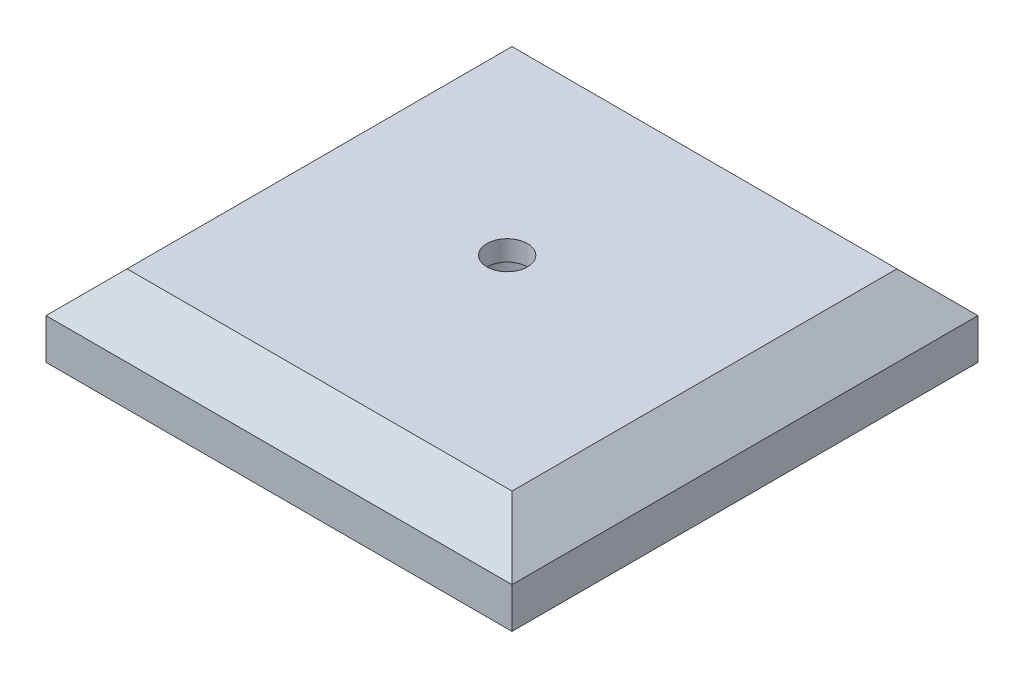
ISO-10303-21;
HEADER;
FILE_DESCRIPTION(('STEP AP214'),'2;1');
FILE_NAME('part.step','',(''),(''),'','','');
FILE_SCHEMA(('AUTOMOTIVE_DESIGN { 1 0 10303 214 1 1 1 1 }'));
ENDSEC;
DATA;
#1=APPLICATION_CONTEXT('core data for automotive mechanical design processes');
#2=APPLICATION_PROTOCOL_DEFINITION('international standard','automotive_design',2000,#1);
#3=PRODUCT_CONTEXT('',#1,'mechanical');
#4=PRODUCT('Part','Part','',(#3));
#5=PRODUCT_RELATED_PRODUCT_CATEGORY('part','',(#4));
#6=PRODUCT_DEFINITION_FORMATION('','',#4);
#7=PRODUCT_DEFINITION_CONTEXT('part definition',#1,'design');
#8=PRODUCT_DEFINITION('design','',#6,#7);
#9=PRODUCT_DEFINITION_SHAPE('','',#8);
#10=(LENGTH_UNIT() NAMED_UNIT(*) SI_UNIT(.MILLI.,.METRE.));
#11=(NAMED_UNIT(*) PLANE_ANGLE_UNIT() SI_UNIT($,.RADIAN.));
#12=(NAMED_UNIT(*) SI_UNIT($,.STERADIAN.) SOLID_ANGLE_UNIT());
#13=UNCERTAINTY_MEASURE_WITH_UNIT(LENGTH_MEASURE(1.E-05),#10,'distance_accuracy_value','');
#14=(GEOMETRIC_REPRESENTATION_CONTEXT(3) GLOBAL_UNCERTAINTY_ASSIGNED_CONTEXT((#13)) GLOBAL_UNIT_ASSIGNED_CONTEXT((#10,
#11,#12)) REPRESENTATION_CONTEXT('',''));
#15=CARTESIAN_POINT('',(0.,0.,0.));
#16=DIRECTION('',(0.,0.,1.));
#17=DIRECTION('',(1.,0.,0.));
#18=AXIS2_PLACEMENT_3D('',#15,#16,#17);
#19=CARTESIAN_POINT('',(3.52085954754864E-13,500.,2875.));
#20=DIRECTION('',(0.,0.,1.));
#21=DIRECTION('',(1.,0.,0.));
#22=AXIS2_PLACEMENT_3D('',#19,#20,#21);
#23=PLANE('',#22);
#24=DIRECTION('',(0.,-1.,0.));
#25=VECTOR('',#24,1.);
#26=CARTESIAN_POINT('',(3.52085954754864E-13,500.,2875.));
#27=LINE('',#26,#25);
#28=CARTESIAN_POINT('',(3.52085954754864E-13,249.999999999999,2875.));
#29=VERTEX_POINT('',#28);
#30=CARTESIAN_POINT('',(3.52085954754864E-13,0.,2875.));
#31=VERTEX_POINT('',#30);
#32=EDGE_CURVE('E118',#29,#31,#27,.T.);
#33=ORIENTED_EDGE('',*,*,#32,.F.);
#34=DIRECTION('',(-1.,0.,0.));
#35=VECTOR('',#34,1.);
#36=CARTESIAN_POINT('',(3.52085954754864E-13,249.999999999999,2875.));
#37=LINE('',#36,#35);
#38=CARTESIAN_POINT('',(-2875.,249.999999999999,2875.));
#39=VERTEX_POINT('',#38);
#40=EDGE_CURVE('E11',#29,#39,#37,.T.);
#41=ORIENTED_EDGE('',*,*,#40,.T.);
#42=DIRECTION('',(0.,-1.,0.));
#43=VECTOR('',#42,1.);
#44=CARTESIAN_POINT('',(-2875.,500.,2875.));
#45=LINE('',#44,#43);
#46=CARTESIAN_POINT('',(-2875.,0.,2875.));
#47=VERTEX_POINT('',#46);
#48=EDGE_CURVE('E87',#39,#47,#45,.T.);
#49=ORIENTED_EDGE('',*,*,#48,.T.);
#50=DIRECTION('',(-1.,0.,0.));
#51=VECTOR('',#50,1.);
#52=CARTESIAN_POINT('',(3.52085954754864E-13,0.,2875.));
#53=LINE('',#52,#51);
#54=EDGE_CURVE('E90',#31,#47,#53,.T.);
#55=ORIENTED_EDGE('',*,*,#54,.F.);
#56=EDGE_LOOP('',(#33,#41,#49,#55));
#57=FACE_BOUND('',#56,.T.);
#58=ADVANCED_FACE('F33',(#57),#23,.T.);
#59=CARTESIAN_POINT('',(0.,500.,0.));
#60=DIRECTION('',(1.,0.,0.));
#61=DIRECTION('',(0.,0.,-1.));
#62=AXIS2_PLACEMENT_3D('',#59,#60,#61);
#63=PLANE('',#62);
#64=DIRECTION('',(0.,-1.,0.));
#65=VECTOR('',#64,1.);
#66=CARTESIAN_POINT('',(0.,500.,0.));
#67=LINE('',#66,#65);
#68=CARTESIAN_POINT('',(0.,249.999999999999,0.));
#69=VERTEX_POINT('',#68);
#70=CARTESIAN_POINT('',(0.,0.,0.));
#71=VERTEX_POINT('',#70);
#72=EDGE_CURVE('E121',#69,#71,#67,.T.);
#73=ORIENTED_EDGE('',*,*,#72,.F.);
#74=DIRECTION('',(0.,0.,1.));
#75=VECTOR('',#74,1.);
#76=CARTESIAN_POINT('',(0.,249.999999999999,0.));
#77=LINE('',#76,#75);
#78=EDGE_CURVE('E42',#69,#29,#77,.T.);
#79=ORIENTED_EDGE('',*,*,#78,.T.);
#80=ORIENTED_EDGE('',*,*,#32,.T.);
#81=DIRECTION('',(0.,0.,1.));
#82=VECTOR('',#81,1.);
#83=CARTESIAN_POINT('',(0.,0.,0.));
#84=LINE('',#83,#82);
#85=EDGE_CURVE('E97',#71,#31,#84,.T.);
#86=ORIENTED_EDGE('',*,*,#85,.F.);
#87=EDGE_LOOP('',(#73,#79,#80,#86));
#88=FACE_BOUND('',#87,.T.);
#89=ADVANCED_FACE('F156',(#88),#63,.T.);
#90=CARTESIAN_POINT('',(0.,500.,0.));
#91=DIRECTION('',(0.,0.,1.));
#92=DIRECTION('',(1.,0.,0.));
#93=AXIS2_PLACEMENT_3D('',#90,#91,#92);
#94=PLANE('',#93);
#95=DIRECTION('',(0.,-1.,0.));
#96=VECTOR('',#95,1.);
#97=CARTESIAN_POINT('',(-2875.,500.,3.52085954754864E-13));
#98=LINE('',#97,#96);
#99=CARTESIAN_POINT('',(-2875.,249.999999999999,3.52085954754864E-13));
#100=VERTEX_POINT('',#99);
#101=CARTESIAN_POINT('',(-2875.,0.,3.52085954754864E-13));
#102=VERTEX_POINT('',#101);
#103=EDGE_CURVE('E96',#100,#102,#98,.T.);
#104=ORIENTED_EDGE('',*,*,#103,.F.);
#105=DIRECTION('',(1.,0.,0.));
#106=VECTOR('',#105,1.);
#107=CARTESIAN_POINT('',(0.,249.999999999999,0.));
#108=LINE('',#107,#106);
#109=EDGE_CURVE('E57',#100,#69,#108,.T.);
#110=ORIENTED_EDGE('',*,*,#109,.T.);
#111=ORIENTED_EDGE('',*,*,#72,.T.);
#112=DIRECTION('',(-1.,0.,0.));
#113=VECTOR('',#112,1.);
#114=CARTESIAN_POINT('',(0.,0.,0.));
#115=LINE('',#114,#113);
#116=EDGE_CURVE('E105',#71,#102,#115,.T.);
#117=ORIENTED_EDGE('',*,*,#116,.T.);
#118=EDGE_LOOP('',(#104,#110,#111,#117));
#119=FACE_BOUND('',#118,.T.);
#120=ADVANCED_FACE('F155',(#119),#94,.F.);
#121=CARTESIAN_POINT('',(-2875.,500.,3.52085954754864E-13));
#122=DIRECTION('',(1.,0.,0.));
#123=DIRECTION('',(0.,0.,-1.));
#124=AXIS2_PLACEMENT_3D('',#121,#122,#123);
#125=PLANE('',#124);
#126=ORIENTED_EDGE('',*,*,#48,.F.);
#127=DIRECTION('',(0.,0.,-1.));
#128=VECTOR('',#127,1.);
#129=CARTESIAN_POINT('',(-2875.,249.999999999999,3.52085954754864E-13));
#130=LINE('',#129,#128);
#131=EDGE_CURVE('E132',#39,#100,#130,.T.);
#132=ORIENTED_EDGE('',*,*,#131,.T.);
#133=ORIENTED_EDGE('',*,*,#103,.T.);
#134=DIRECTION('',(0.,0.,1.));
#135=VECTOR('',#134,1.);
#136=CARTESIAN_POINT('',(-2875.,0.,3.52085954754864E-13));
#137=LINE('',#136,#135);
#138=EDGE_CURVE('E100',#102,#47,#137,.T.);
#139=ORIENTED_EDGE('',*,*,#138,.T.);
#140=EDGE_LOOP('',(#126,#132,#133,#139));
#141=FACE_BOUND('',#140,.T.);
#142=ADVANCED_FACE('F101',(#141),#125,.F.);
#143=CARTESIAN_POINT('',(0.,500.,0.));
#144=DIRECTION('',(0.,1.,0.));
#145=DIRECTION('',(0.,0.,1.));
#146=AXIS2_PLACEMENT_3D('',#143,#144,#145);
#147=PLANE('',#146);
#148=CARTESIAN_POINT('',(-1524.95517135532,500.,1379.81277519685));
#149=DIRECTION('',(0.,1.,0.));
#150=DIRECTION('',(0.,0.,1.));
#151=AXIS2_PLACEMENT_3D('',#148,#149,#150);
#152=CIRCLE('',#151,125.);
#153=CARTESIAN_POINT('',(-1524.95517135532,500.,1504.81277519685));
#154=VERTEX_POINT('',#153);
#155=EDGE_CURVE('E197',#154,#154,#152,.T.);
#156=ORIENTED_EDGE('',*,*,#155,.F.);
#157=EDGE_LOOP('',(#156));
#158=FACE_BOUND('',#157,.T.);
#159=DIRECTION('',(-1.,0.,0.));
#160=VECTOR('',#159,1.);
#161=CARTESIAN_POINT('',(-2875.,500.,250.000000000002));
#162=LINE('',#161,#160);
#163=CARTESIAN_POINT('',(-250.000000000001,500.,250.000000000001));
#164=VERTEX_POINT('',#163);
#165=CARTESIAN_POINT('',(-2625.,500.,250.000000000002));
#166=VERTEX_POINT('',#165);
#167=EDGE_CURVE('E127',#164,#166,#162,.T.);
#168=ORIENTED_EDGE('',*,*,#167,.T.);
#169=DIRECTION('',(0.,0.,1.));
#170=VECTOR('',#169,1.);
#171=CARTESIAN_POINT('',(-2625.,500.,2875.));
#172=LINE('',#171,#170);
#173=CARTESIAN_POINT('',(-2625.,500.,2625.));
#174=VERTEX_POINT('',#173);
#175=EDGE_CURVE('E129',#166,#174,#172,.T.);
#176=ORIENTED_EDGE('',*,*,#175,.T.);
#177=DIRECTION('',(1.,0.,0.));
#178=VECTOR('',#177,1.);
#179=CARTESIAN_POINT('',(4.05472756819622E-13,500.,2625.));
#180=LINE('',#179,#178);
#181=CARTESIAN_POINT('',(-250.000000000001,500.,2625.));
#182=VERTEX_POINT('',#181);
#183=EDGE_CURVE('E120',#174,#182,#180,.T.);
#184=ORIENTED_EDGE('',*,*,#183,.T.);
#185=DIRECTION('',(0.,0.,-1.));
#186=VECTOR('',#185,1.);
#187=CARTESIAN_POINT('',(-250.000000000001,500.,0.));
#188=LINE('',#187,#186);
#189=EDGE_CURVE('E125',#182,#164,#188,.T.);
#190=ORIENTED_EDGE('',*,*,#189,.T.);
#191=EDGE_LOOP('',(#168,#176,#184,#190));
#192=FACE_BOUND('',#191,.T.);
#193=ADVANCED_FACE('F150',(#158,#192),#147,.T.);
#194=CARTESIAN_POINT('',(0.,0.,0.));
#195=DIRECTION('',(0.,1.,0.));
#196=DIRECTION('',(0.,0.,1.));
#197=AXIS2_PLACEMENT_3D('',#194,#195,#196);
#198=PLANE('',#197);
#199=CARTESIAN_POINT('',(-1524.95517135532,0.,1379.81277519685));
#200=DIRECTION('',(0.,1.,0.));
#201=DIRECTION('',(0.,0.,1.));
#202=AXIS2_PLACEMENT_3D('',#199,#200,#201);
#203=CIRCLE('',#202,250.);
#204=CARTESIAN_POINT('',(-1524.95517135532,0.,1629.81277519685));
#205=VERTEX_POINT('',#204);
#206=EDGE_CURVE('E113',#205,#205,#203,.T.);
#207=ORIENTED_EDGE('',*,*,#206,.T.);
#208=EDGE_LOOP('',(#207));
#209=FACE_BOUND('',#208,.T.);
#210=ORIENTED_EDGE('',*,*,#54,.T.);
#211=ORIENTED_EDGE('',*,*,#138,.F.);
#212=ORIENTED_EDGE('',*,*,#116,.F.);
#213=ORIENTED_EDGE('',*,*,#85,.T.);
#214=EDGE_LOOP('',(#210,#211,#212,#213));
#215=FACE_BOUND('',#214,.T.);
#216=ADVANCED_FACE('F107',(#209,#215),#198,.F.);
#217=CARTESIAN_POINT('',(0.,249.999999999999,0.));
#218=DIRECTION('',(-0.707106781186547,-0.707106781186547,0.));
#219=DIRECTION('',(0.,0.,1.));
#220=AXIS2_PLACEMENT_3D('',#217,#218,#219);
#221=PLANE('',#220);
#222=DIRECTION('',(-0.577350269189626,0.577350269189625,-0.577350269189626));
#223=VECTOR('',#222,1.);
#224=CARTESIAN_POINT('',(3.52085954754864E-13,249.999999999999,2875.));
#225=LINE('',#224,#223);
#226=EDGE_CURVE('E111',#29,#182,#225,.T.);
#227=ORIENTED_EDGE('',*,*,#226,.F.);
#228=ORIENTED_EDGE('',*,*,#78,.F.);
#229=DIRECTION('',(0.577350269189626,-0.577350269189626,-0.577350269189626));
#230=VECTOR('',#229,1.);
#231=CARTESIAN_POINT('',(0.,249.999999999999,0.));
#232=LINE('',#231,#230);
#233=EDGE_CURVE('E37',#164,#69,#232,.T.);
#234=ORIENTED_EDGE('',*,*,#233,.F.);
#235=ORIENTED_EDGE('',*,*,#189,.F.);
#236=EDGE_LOOP('',(#227,#228,#234,#235));
#237=FACE_BOUND('',#236,.T.);
#238=ADVANCED_FACE('F35',(#237),#221,.F.);
#239=CARTESIAN_POINT('',(0.,500.,250.000000000001));
#240=DIRECTION('',(0.,0.707106781186547,-0.707106781186547));
#241=DIRECTION('',(1.,0.,0.));
#242=AXIS2_PLACEMENT_3D('',#239,#240,#241);
#243=PLANE('',#242);
#244=ORIENTED_EDGE('',*,*,#233,.T.);
#245=ORIENTED_EDGE('',*,*,#109,.F.);
#246=DIRECTION('',(0.577350269189627,0.577350269189626,0.577350269189625));
#247=VECTOR('',#246,1.);
#248=CARTESIAN_POINT('',(-1750.,1375.,1125.));
#249=LINE('',#248,#247);
#250=EDGE_CURVE('E138',#166,#100,#249,.F.);
#251=ORIENTED_EDGE('',*,*,#250,.F.);
#252=ORIENTED_EDGE('',*,*,#167,.F.);
#253=EDGE_LOOP('',(#244,#245,#251,#252));
#254=FACE_BOUND('',#253,.T.);
#255=ADVANCED_FACE('F174',(#254),#243,.T.);
#256=CARTESIAN_POINT('',(3.52085954754864E-13,249.999999999999,2875.));
#257=DIRECTION('',(0.,-0.707106781186548,-0.707106781186547));
#258=DIRECTION('',(-1.,0.,0.));
#259=AXIS2_PLACEMENT_3D('',#256,#257,#258);
#260=PLANE('',#259);
#261=ORIENTED_EDGE('',*,*,#226,.T.);
#262=ORIENTED_EDGE('',*,*,#183,.F.);
#263=DIRECTION('',(0.577350269189626,0.577350269189625,-0.577350269189626));
#264=VECTOR('',#263,1.);
#265=CARTESIAN_POINT('',(-1916.66666666667,1208.33333333333,1916.66666666667));
#266=LINE('',#265,#264);
#267=EDGE_CURVE('E136',#39,#174,#266,.T.);
#268=ORIENTED_EDGE('',*,*,#267,.F.);
#269=ORIENTED_EDGE('',*,*,#40,.F.);
#270=EDGE_LOOP('',(#261,#262,#268,#269));
#271=FACE_BOUND('',#270,.T.);
#272=ADVANCED_FACE('F143',(#271),#260,.F.);
#273=CARTESIAN_POINT('',(-2625.,500.,4.05472756819622E-13));
#274=DIRECTION('',(-0.707106781186547,0.707106781186548,0.));
#275=DIRECTION('',(0.,0.,-1.));
#276=AXIS2_PLACEMENT_3D('',#273,#274,#275);
#277=PLANE('',#276);
#278=ORIENTED_EDGE('',*,*,#250,.T.);
#279=ORIENTED_EDGE('',*,*,#131,.F.);
#280=ORIENTED_EDGE('',*,*,#267,.T.);
#281=ORIENTED_EDGE('',*,*,#175,.F.);
#282=EDGE_LOOP('',(#278,#279,#280,#281));
#283=FACE_BOUND('',#282,.T.);
#284=ADVANCED_FACE('F154',(#283),#277,.T.);
#285=CARTESIAN_POINT('',(-1524.95517135532,500.,1379.81277519685));
#286=DIRECTION('',(0.,1.,0.));
#287=DIRECTION('',(0.,0.,1.));
#288=AXIS2_PLACEMENT_3D('',#285,#286,#287);
#289=CYLINDRICAL_SURFACE('',#288,250.);
#290=ORIENTED_EDGE('',*,*,#206,.F.);
#291=EDGE_LOOP('',(#290));
#292=FACE_BOUND('',#291,.T.);
#293=CARTESIAN_POINT('',(-1524.95517135532,375.,1379.81277519685));
#294=DIRECTION('',(0.,1.,0.));
#295=DIRECTION('',(0.,0.,1.));
#296=AXIS2_PLACEMENT_3D('',#293,#294,#295);
#297=CIRCLE('',#296,250.);
#298=CARTESIAN_POINT('',(-1524.95517135532,375.,1629.81277519685));
#299=VERTEX_POINT('',#298);
#300=EDGE_CURVE('E191',#299,#299,#297,.T.);
#301=ORIENTED_EDGE('',*,*,#300,.T.);
#302=EDGE_LOOP('',(#301));
#303=FACE_BOUND('',#302,.T.);
#304=ADVANCED_FACE('F172',(#292,#303),#289,.F.);
#305=CARTESIAN_POINT('',(-1274.95517135532,375.,1379.81277519685));
#306=DIRECTION('',(0.,1.,0.));
#307=DIRECTION('',(0.,0.,1.));
#308=AXIS2_PLACEMENT_3D('',#305,#306,#307);
#309=PLANE('',#308);
#310=ORIENTED_EDGE('',*,*,#300,.F.);
#311=EDGE_LOOP('',(#310));
#312=FACE_BOUND('',#311,.T.);
#313=CARTESIAN_POINT('',(-1524.95517135532,375.,1379.81277519685));
#314=DIRECTION('',(0.,1.,0.));
#315=DIRECTION('',(0.,0.,1.));
#316=AXIS2_PLACEMENT_3D('',#313,#314,#315);
#317=CIRCLE('',#316,125.);
#318=CARTESIAN_POINT('',(-1524.95517135532,375.,1504.81277519685));
#319=VERTEX_POINT('',#318);
#320=EDGE_CURVE('E193',#319,#319,#317,.T.);
#321=ORIENTED_EDGE('',*,*,#320,.T.);
#322=EDGE_LOOP('',(#321));
#323=FACE_BOUND('',#322,.T.);
#324=ADVANCED_FACE('F205',(#312,#323),#309,.F.);
#325=CARTESIAN_POINT('',(-1524.95517135532,500.,1379.81277519685));
#326=DIRECTION('',(0.,1.,0.));
#327=DIRECTION('',(0.,0.,1.));
#328=AXIS2_PLACEMENT_3D('',#325,#326,#327);
#329=CYLINDRICAL_SURFACE('',#328,125.);
#330=ORIENTED_EDGE('',*,*,#320,.F.);
#331=EDGE_LOOP('',(#330));
#332=FACE_BOUND('',#331,.T.);
#333=ORIENTED_EDGE('',*,*,#155,.T.);
#334=EDGE_LOOP('',(#333));
#335=FACE_BOUND('',#334,.T.);
#336=ADVANCED_FACE('F203',(#332,#335),#329,.F.);
#337=CLOSED_SHELL('',(#58,#89,#120,#142,#193,#216,#238,#255,#272,#284,#304,#324,#336));
#338=MANIFOLD_SOLID_BREP('B2',#337);
#339=ADVANCED_BREP_SHAPE_REPRESENTATION('',(#18,#338),#14);
#340=SHAPE_DEFINITION_REPRESENTATION(#9,#339);
ENDSEC;
END-ISO-10303-21;
